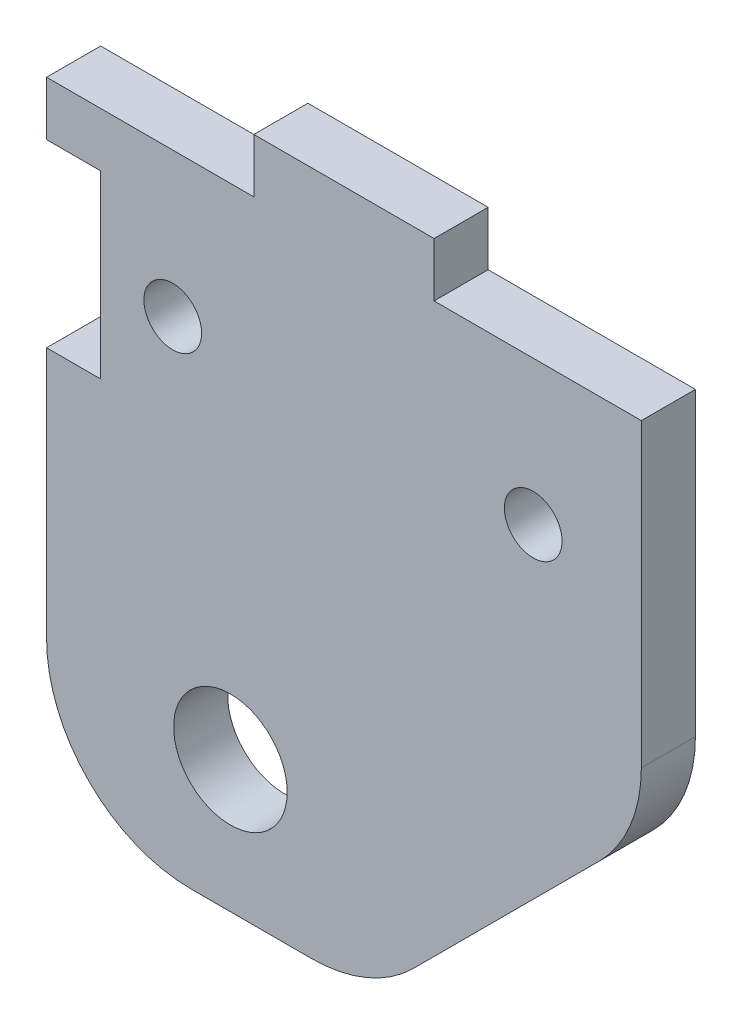
ISO-10303-21;
HEADER;
FILE_DESCRIPTION(('STEP AP214'),'2;1');
FILE_NAME('part.step','',(''),(''),'','','');
FILE_SCHEMA(('AUTOMOTIVE_DESIGN { 1 0 10303 214 1 1 1 1 }'));
ENDSEC;
DATA;
#1=APPLICATION_CONTEXT('core data for automotive mechanical design processes');
#2=APPLICATION_PROTOCOL_DEFINITION('international standard','automotive_design',2000,#1);
#3=PRODUCT_CONTEXT('',#1,'mechanical');
#4=PRODUCT('Part','Part','',(#3));
#5=PRODUCT_RELATED_PRODUCT_CATEGORY('part','',(#4));
#6=PRODUCT_DEFINITION_FORMATION('','',#4);
#7=PRODUCT_DEFINITION_CONTEXT('part definition',#1,'design');
#8=PRODUCT_DEFINITION('design','',#6,#7);
#9=PRODUCT_DEFINITION_SHAPE('','',#8);
#10=(LENGTH_UNIT() NAMED_UNIT(*) SI_UNIT(.MILLI.,.METRE.));
#11=(NAMED_UNIT(*) PLANE_ANGLE_UNIT() SI_UNIT($,.RADIAN.));
#12=(NAMED_UNIT(*) SI_UNIT($,.STERADIAN.) SOLID_ANGLE_UNIT());
#13=UNCERTAINTY_MEASURE_WITH_UNIT(LENGTH_MEASURE(1.E-05),#10,'distance_accuracy_value','');
#14=(GEOMETRIC_REPRESENTATION_CONTEXT(3) GLOBAL_UNCERTAINTY_ASSIGNED_CONTEXT((#13)) GLOBAL_UNIT_ASSIGNED_CONTEXT((#10,
#11,#12)) REPRESENTATION_CONTEXT('',''));
#15=CARTESIAN_POINT('',(0.,0.,0.));
#16=DIRECTION('',(0.,0.,1.));
#17=DIRECTION('',(1.,0.,0.));
#18=AXIS2_PLACEMENT_3D('',#15,#16,#17);
#19=CARTESIAN_POINT('',(0.,-3.,3.));
#20=DIRECTION('',(0.,-1.,0.));
#21=DIRECTION('',(1.,0.,0.));
#22=AXIS2_PLACEMENT_3D('',#19,#20,#21);
#23=PLANE('',#22);
#24=DIRECTION('',(-1.,0.,0.));
#25=VECTOR('',#24,1.);
#26=CARTESIAN_POINT('',(0.,-3.,0.));
#27=LINE('',#26,#25);
#28=CARTESIAN_POINT('',(3.,-3.,0.));
#29=VERTEX_POINT('',#28);
#30=CARTESIAN_POINT('',(0.,-3.,0.));
#31=VERTEX_POINT('',#30);
#32=EDGE_CURVE('E162',#29,#31,#27,.T.);
#33=ORIENTED_EDGE('',*,*,#32,.F.);
#34=DIRECTION('',(0.,0.,-1.));
#35=VECTOR('',#34,1.);
#36=CARTESIAN_POINT('',(3.,-3.,3.));
#37=LINE('',#36,#35);
#38=CARTESIAN_POINT('',(3.,-3.,3.));
#39=VERTEX_POINT('',#38);
#40=EDGE_CURVE('E157',#39,#29,#37,.T.);
#41=ORIENTED_EDGE('',*,*,#40,.F.);
#42=DIRECTION('',(-1.,0.,0.));
#43=VECTOR('',#42,1.);
#44=CARTESIAN_POINT('',(0.,-3.,3.));
#45=LINE('',#44,#43);
#46=CARTESIAN_POINT('',(0.,-3.,3.));
#47=VERTEX_POINT('',#46);
#48=EDGE_CURVE('E159',#39,#47,#45,.T.);
#49=ORIENTED_EDGE('',*,*,#48,.T.);
#50=DIRECTION('',(0.,0.,-1.));
#51=VECTOR('',#50,1.);
#52=CARTESIAN_POINT('',(0.,-3.,3.));
#53=LINE('',#52,#51);
#54=EDGE_CURVE('E243',#47,#31,#53,.T.);
#55=ORIENTED_EDGE('',*,*,#54,.T.);
#56=EDGE_LOOP('',(#33,#41,#49,#55));
#57=FACE_BOUND('',#56,.T.);
#58=ADVANCED_FACE('F41',(#57),#23,.T.);
#59=CARTESIAN_POINT('',(3.,0.,3.));
#60=DIRECTION('',(-1.,0.,0.));
#61=DIRECTION('',(0.,0.,1.));
#62=AXIS2_PLACEMENT_3D('',#59,#60,#61);
#63=PLANE('',#62);
#64=DIRECTION('',(0.,1.,0.));
#65=VECTOR('',#64,1.);
#66=CARTESIAN_POINT('',(3.,0.,0.));
#67=LINE('',#66,#65);
#68=CARTESIAN_POINT('',(3.,-13.,0.));
#69=VERTEX_POINT('',#68);
#70=EDGE_CURVE('E216',#69,#29,#67,.T.);
#71=ORIENTED_EDGE('',*,*,#70,.F.);
#72=DIRECTION('',(0.,0.,-1.));
#73=VECTOR('',#72,1.);
#74=CARTESIAN_POINT('',(3.,-13.,3.));
#75=LINE('',#74,#73);
#76=CARTESIAN_POINT('',(3.,-13.,3.));
#77=VERTEX_POINT('',#76);
#78=EDGE_CURVE('E168',#77,#69,#75,.T.);
#79=ORIENTED_EDGE('',*,*,#78,.F.);
#80=DIRECTION('',(0.,1.,0.));
#81=VECTOR('',#80,1.);
#82=CARTESIAN_POINT('',(3.,0.,3.));
#83=LINE('',#82,#81);
#84=EDGE_CURVE('E174',#77,#39,#83,.T.);
#85=ORIENTED_EDGE('',*,*,#84,.T.);
#86=ORIENTED_EDGE('',*,*,#40,.T.);
#87=EDGE_LOOP('',(#71,#79,#85,#86));
#88=FACE_BOUND('',#87,.T.);
#89=ADVANCED_FACE('F180',(#88),#63,.T.);
#90=CARTESIAN_POINT('',(0.,-13.,3.));
#91=DIRECTION('',(0.,-1.,0.));
#92=DIRECTION('',(0.,0.,-1.));
#93=AXIS2_PLACEMENT_3D('',#90,#91,#92);
#94=PLANE('',#93);
#95=DIRECTION('',(-1.,0.,0.));
#96=VECTOR('',#95,1.);
#97=CARTESIAN_POINT('',(0.,-13.,0.));
#98=LINE('',#97,#96);
#99=CARTESIAN_POINT('',(0.,-13.,0.));
#100=VERTEX_POINT('',#99);
#101=EDGE_CURVE('E218',#69,#100,#98,.T.);
#102=ORIENTED_EDGE('',*,*,#101,.T.);
#103=DIRECTION('',(0.,0.,-1.));
#104=VECTOR('',#103,1.);
#105=CARTESIAN_POINT('',(0.,-13.,3.));
#106=LINE('',#105,#104);
#107=CARTESIAN_POINT('',(0.,-13.,3.));
#108=VERTEX_POINT('',#107);
#109=EDGE_CURVE('E258',#108,#100,#106,.T.);
#110=ORIENTED_EDGE('',*,*,#109,.F.);
#111=DIRECTION('',(-1.,0.,0.));
#112=VECTOR('',#111,1.);
#113=CARTESIAN_POINT('',(0.,-13.,3.));
#114=LINE('',#113,#112);
#115=EDGE_CURVE('E182',#77,#108,#114,.T.);
#116=ORIENTED_EDGE('',*,*,#115,.F.);
#117=ORIENTED_EDGE('',*,*,#78,.T.);
#118=EDGE_LOOP('',(#102,#110,#116,#117));
#119=FACE_BOUND('',#118,.T.);
#120=ADVANCED_FACE('F308',(#119),#94,.F.);
#121=CARTESIAN_POINT('',(0.,0.,3.));
#122=DIRECTION('',(-1.,0.,0.));
#123=DIRECTION('',(0.,0.,1.));
#124=AXIS2_PLACEMENT_3D('',#121,#122,#123);
#125=PLANE('',#124);
#126=DIRECTION('',(0.,1.,0.));
#127=VECTOR('',#126,1.);
#128=CARTESIAN_POINT('',(0.,0.,0.));
#129=LINE('',#128,#127);
#130=CARTESIAN_POINT('',(0.,-27.,0.));
#131=VERTEX_POINT('',#130);
#132=EDGE_CURVE('E221',#131,#100,#129,.T.);
#133=ORIENTED_EDGE('',*,*,#132,.F.);
#134=DIRECTION('',(0.,0.,-1.));
#135=VECTOR('',#134,1.);
#136=CARTESIAN_POINT('',(0.,-27.,3.));
#137=LINE('',#136,#135);
#138=CARTESIAN_POINT('',(0.,-27.,3.));
#139=VERTEX_POINT('',#138);
#140=EDGE_CURVE('E278',#131,#139,#137,.F.);
#141=ORIENTED_EDGE('',*,*,#140,.T.);
#142=DIRECTION('',(0.,1.,0.));
#143=VECTOR('',#142,1.);
#144=CARTESIAN_POINT('',(0.,0.,3.));
#145=LINE('',#144,#143);
#146=EDGE_CURVE('E184',#139,#108,#145,.T.);
#147=ORIENTED_EDGE('',*,*,#146,.T.);
#148=ORIENTED_EDGE('',*,*,#109,.T.);
#149=EDGE_LOOP('',(#133,#141,#147,#148));
#150=FACE_BOUND('',#149,.T.);
#151=ADVANCED_FACE('F305',(#150),#125,.T.);
#152=CARTESIAN_POINT('',(0.,-35.,3.));
#153=DIRECTION('',(0.,-1.,0.));
#154=DIRECTION('',(1.,0.,0.));
#155=AXIS2_PLACEMENT_3D('',#152,#153,#154);
#156=PLANE('',#155);
#157=DIRECTION('',(-1.,0.,0.));
#158=VECTOR('',#157,1.);
#159=CARTESIAN_POINT('',(0.,-35.,3.));
#160=LINE('',#159,#158);
#161=CARTESIAN_POINT('',(14.6862915010152,-35.,3.));
#162=VERTEX_POINT('',#161);
#163=CARTESIAN_POINT('',(8.,-35.,3.));
#164=VERTEX_POINT('',#163);
#165=EDGE_CURVE('E189',#162,#164,#160,.T.);
#166=ORIENTED_EDGE('',*,*,#165,.T.);
#167=DIRECTION('',(0.,0.,-1.));
#168=VECTOR('',#167,1.);
#169=CARTESIAN_POINT('',(8.,-35.,3.));
#170=LINE('',#169,#168);
#171=CARTESIAN_POINT('',(8.,-35.,0.));
#172=VERTEX_POINT('',#171);
#173=EDGE_CURVE('E269',#164,#172,#170,.T.);
#174=ORIENTED_EDGE('',*,*,#173,.T.);
#175=DIRECTION('',(-1.,0.,0.));
#176=VECTOR('',#175,1.);
#177=CARTESIAN_POINT('',(0.,-35.,0.));
#178=LINE('',#177,#176);
#179=CARTESIAN_POINT('',(14.6862915010152,-35.,0.));
#180=VERTEX_POINT('',#179);
#181=EDGE_CURVE('E223',#180,#172,#178,.T.);
#182=ORIENTED_EDGE('',*,*,#181,.F.);
#183=DIRECTION('',(0.,0.,-1.));
#184=VECTOR('',#183,1.);
#185=CARTESIAN_POINT('',(14.6862915010152,-35.,3.));
#186=LINE('',#185,#184);
#187=EDGE_CURVE('E266',#180,#162,#186,.F.);
#188=ORIENTED_EDGE('',*,*,#187,.T.);
#189=EDGE_LOOP('',(#166,#174,#182,#188));
#190=FACE_BOUND('',#189,.T.);
#191=ADVANCED_FACE('F296',(#190),#156,.T.);
#192=CARTESIAN_POINT('',(33.,0.,3.));
#193=DIRECTION('',(1.,0.,0.));
#194=DIRECTION('',(0.,1.,0.));
#195=AXIS2_PLACEMENT_3D('',#192,#193,#194);
#196=PLANE('',#195);
#197=DIRECTION('',(0.,-1.,0.));
#198=VECTOR('',#197,1.);
#199=CARTESIAN_POINT('',(33.,0.,3.));
#200=LINE('',#199,#198);
#201=CARTESIAN_POINT('',(33.,0.,3.));
#202=VERTEX_POINT('',#201);
#203=CARTESIAN_POINT('',(33.,-16.6862915010152,3.));
#204=VERTEX_POINT('',#203);
#205=EDGE_CURVE('E192',#202,#204,#200,.T.);
#206=ORIENTED_EDGE('',*,*,#205,.T.);
#207=DIRECTION('',(0.,0.,1.));
#208=VECTOR('',#207,1.);
#209=CARTESIAN_POINT('',(33.,-16.6862915010152,3.));
#210=LINE('',#209,#208);
#211=CARTESIAN_POINT('',(33.,-16.6862915010152,0.));
#212=VERTEX_POINT('',#211);
#213=EDGE_CURVE('E11',#204,#212,#210,.F.);
#214=ORIENTED_EDGE('',*,*,#213,.T.);
#215=DIRECTION('',(0.,-1.,0.));
#216=VECTOR('',#215,1.);
#217=CARTESIAN_POINT('',(33.,0.,0.));
#218=LINE('',#217,#216);
#219=CARTESIAN_POINT('',(33.,0.,0.));
#220=VERTEX_POINT('',#219);
#221=EDGE_CURVE('E227',#220,#212,#218,.T.);
#222=ORIENTED_EDGE('',*,*,#221,.F.);
#223=DIRECTION('',(0.,0.,-1.));
#224=VECTOR('',#223,1.);
#225=CARTESIAN_POINT('',(33.,0.,3.));
#226=LINE('',#225,#224);
#227=EDGE_CURVE('E256',#202,#220,#226,.T.);
#228=ORIENTED_EDGE('',*,*,#227,.F.);
#229=EDGE_LOOP('',(#206,#214,#222,#228));
#230=FACE_BOUND('',#229,.T.);
#231=ADVANCED_FACE('F340',(#230),#196,.T.);
#232=CARTESIAN_POINT('',(0.,0.,3.));
#233=DIRECTION('',(0.,1.,0.));
#234=DIRECTION('',(0.,0.,1.));
#235=AXIS2_PLACEMENT_3D('',#232,#233,#234);
#236=PLANE('',#235);
#237=DIRECTION('',(1.,0.,0.));
#238=VECTOR('',#237,1.);
#239=CARTESIAN_POINT('',(0.,0.,0.));
#240=LINE('',#239,#238);
#241=CARTESIAN_POINT('',(21.5,0.,0.));
#242=VERTEX_POINT('',#241);
#243=EDGE_CURVE('E230',#242,#220,#240,.T.);
#244=ORIENTED_EDGE('',*,*,#243,.F.);
#245=DIRECTION('',(0.,0.,-1.));
#246=VECTOR('',#245,1.);
#247=CARTESIAN_POINT('',(21.5,0.,3.));
#248=LINE('',#247,#246);
#249=CARTESIAN_POINT('',(21.5,0.,3.));
#250=VERTEX_POINT('',#249);
#251=EDGE_CURVE('E254',#250,#242,#248,.T.);
#252=ORIENTED_EDGE('',*,*,#251,.F.);
#253=DIRECTION('',(1.,0.,0.));
#254=VECTOR('',#253,1.);
#255=CARTESIAN_POINT('',(0.,0.,3.));
#256=LINE('',#255,#254);
#257=EDGE_CURVE('E194',#250,#202,#256,.T.);
#258=ORIENTED_EDGE('',*,*,#257,.T.);
#259=ORIENTED_EDGE('',*,*,#227,.T.);
#260=EDGE_LOOP('',(#244,#252,#258,#259));
#261=FACE_BOUND('',#260,.T.);
#262=ADVANCED_FACE('F337',(#261),#236,.T.);
#263=CARTESIAN_POINT('',(21.5,0.,3.));
#264=DIRECTION('',(1.,0.,0.));
#265=DIRECTION('',(0.,0.,-1.));
#266=AXIS2_PLACEMENT_3D('',#263,#264,#265);
#267=PLANE('',#266);
#268=DIRECTION('',(0.,-1.,0.));
#269=VECTOR('',#268,1.);
#270=CARTESIAN_POINT('',(21.5,0.,0.));
#271=LINE('',#270,#269);
#272=CARTESIAN_POINT('',(21.5,3.,0.));
#273=VERTEX_POINT('',#272);
#274=EDGE_CURVE('E233',#273,#242,#271,.T.);
#275=ORIENTED_EDGE('',*,*,#274,.F.);
#276=DIRECTION('',(0.,0.,-1.));
#277=VECTOR('',#276,1.);
#278=CARTESIAN_POINT('',(21.5,3.,3.));
#279=LINE('',#278,#277);
#280=CARTESIAN_POINT('',(21.5,3.,3.));
#281=VERTEX_POINT('',#280);
#282=EDGE_CURVE('E252',#281,#273,#279,.T.);
#283=ORIENTED_EDGE('',*,*,#282,.F.);
#284=DIRECTION('',(0.,-1.,0.));
#285=VECTOR('',#284,1.);
#286=CARTESIAN_POINT('',(21.5,0.,3.));
#287=LINE('',#286,#285);
#288=EDGE_CURVE('E197',#281,#250,#287,.T.);
#289=ORIENTED_EDGE('',*,*,#288,.T.);
#290=ORIENTED_EDGE('',*,*,#251,.T.);
#291=EDGE_LOOP('',(#275,#283,#289,#290));
#292=FACE_BOUND('',#291,.T.);
#293=ADVANCED_FACE('F332',(#292),#267,.T.);
#294=CARTESIAN_POINT('',(0.,2.99999999999999,3.));
#295=DIRECTION('',(0.,-1.,0.));
#296=DIRECTION('',(1.,0.,0.));
#297=AXIS2_PLACEMENT_3D('',#294,#295,#296);
#298=PLANE('',#297);
#299=DIRECTION('',(-1.,0.,0.));
#300=VECTOR('',#299,1.);
#301=CARTESIAN_POINT('',(0.,2.99999999999999,0.));
#302=LINE('',#301,#300);
#303=CARTESIAN_POINT('',(11.5,3.,0.));
#304=VERTEX_POINT('',#303);
#305=EDGE_CURVE('E237',#273,#304,#302,.T.);
#306=ORIENTED_EDGE('',*,*,#305,.T.);
#307=DIRECTION('',(0.,0.,-1.));
#308=VECTOR('',#307,1.);
#309=CARTESIAN_POINT('',(11.5,3.,3.));
#310=LINE('',#309,#308);
#311=CARTESIAN_POINT('',(11.5,3.,3.));
#312=VERTEX_POINT('',#311);
#313=EDGE_CURVE('E249',#312,#304,#310,.T.);
#314=ORIENTED_EDGE('',*,*,#313,.F.);
#315=DIRECTION('',(-1.,0.,0.));
#316=VECTOR('',#315,1.);
#317=CARTESIAN_POINT('',(0.,2.99999999999999,3.));
#318=LINE('',#317,#316);
#319=EDGE_CURVE('E201',#281,#312,#318,.T.);
#320=ORIENTED_EDGE('',*,*,#319,.F.);
#321=ORIENTED_EDGE('',*,*,#282,.T.);
#322=EDGE_LOOP('',(#306,#314,#320,#321));
#323=FACE_BOUND('',#322,.T.);
#324=ADVANCED_FACE('F329',(#323),#298,.F.);
#325=CARTESIAN_POINT('',(11.5,0.,3.));
#326=DIRECTION('',(1.,0.,0.));
#327=DIRECTION('',(0.,1.,0.));
#328=AXIS2_PLACEMENT_3D('',#325,#326,#327);
#329=PLANE('',#328);
#330=DIRECTION('',(0.,-1.,0.));
#331=VECTOR('',#330,1.);
#332=CARTESIAN_POINT('',(11.5,0.,0.));
#333=LINE('',#332,#331);
#334=CARTESIAN_POINT('',(11.5,0.,0.));
#335=VERTEX_POINT('',#334);
#336=EDGE_CURVE('E240',#304,#335,#333,.T.);
#337=ORIENTED_EDGE('',*,*,#336,.T.);
#338=DIRECTION('',(0.,0.,-1.));
#339=VECTOR('',#338,1.);
#340=CARTESIAN_POINT('',(11.5,0.,3.));
#341=LINE('',#340,#339);
#342=CARTESIAN_POINT('',(11.5,0.,3.));
#343=VERTEX_POINT('',#342);
#344=EDGE_CURVE('E247',#343,#335,#341,.T.);
#345=ORIENTED_EDGE('',*,*,#344,.F.);
#346=DIRECTION('',(0.,-1.,0.));
#347=VECTOR('',#346,1.);
#348=CARTESIAN_POINT('',(11.5,0.,3.));
#349=LINE('',#348,#347);
#350=EDGE_CURVE('E204',#312,#343,#349,.T.);
#351=ORIENTED_EDGE('',*,*,#350,.F.);
#352=ORIENTED_EDGE('',*,*,#313,.T.);
#353=EDGE_LOOP('',(#337,#345,#351,#352));
#354=FACE_BOUND('',#353,.T.);
#355=ADVANCED_FACE('F325',(#354),#329,.F.);
#356=CARTESIAN_POINT('',(0.,0.,0.));
#357=VERTEX_POINT('',#356);
#358=EDGE_CURVE('E234',#357,#335,#240,.T.);
#359=ORIENTED_EDGE('',*,*,#358,.F.);
#360=DIRECTION('',(0.,0.,-1.));
#361=VECTOR('',#360,1.);
#362=CARTESIAN_POINT('',(0.,0.,3.));
#363=LINE('',#362,#361);
#364=CARTESIAN_POINT('',(0.,0.,3.));
#365=VERTEX_POINT('',#364);
#366=EDGE_CURVE('E245',#365,#357,#363,.T.);
#367=ORIENTED_EDGE('',*,*,#366,.F.);
#368=EDGE_CURVE('E198',#365,#343,#256,.T.);
#369=ORIENTED_EDGE('',*,*,#368,.T.);
#370=ORIENTED_EDGE('',*,*,#344,.T.);
#371=EDGE_LOOP('',(#359,#367,#369,#370));
#372=FACE_BOUND('',#371,.T.);
#373=ADVANCED_FACE('F321',(#372),#236,.T.);
#374=CARTESIAN_POINT('',(10.2,-27.6842951390846,3.));
#375=DIRECTION('',(0.,0.,-1.));
#376=DIRECTION('',(-1.,0.,0.));
#377=AXIS2_PLACEMENT_3D('',#374,#375,#376);
#378=CYLINDRICAL_SURFACE('',#377,3.14999999999995);
#379=CARTESIAN_POINT('',(10.2,-27.6842951390846,3.));
#380=DIRECTION('',(0.,0.,1.));
#381=DIRECTION('',(1.,0.,0.));
#382=AXIS2_PLACEMENT_3D('',#379,#380,#381);
#383=CIRCLE('',#382,3.14999999999995);
#384=CARTESIAN_POINT('',(13.3499999999999,-27.6842951390846,3.));
#385=VERTEX_POINT('',#384);
#386=EDGE_CURVE('E178',#385,#385,#383,.T.);
#387=ORIENTED_EDGE('',*,*,#386,.T.);
#388=EDGE_LOOP('',(#387));
#389=FACE_BOUND('',#388,.T.);
#390=CARTESIAN_POINT('',(10.2,-27.6842951390846,0.));
#391=DIRECTION('',(0.,0.,1.));
#392=DIRECTION('',(1.,0.,0.));
#393=AXIS2_PLACEMENT_3D('',#390,#391,#392);
#394=CIRCLE('',#393,3.14999999999995);
#395=CARTESIAN_POINT('',(13.3499999999999,-27.6842951390846,0.));
#396=VERTEX_POINT('',#395);
#397=EDGE_CURVE('E212',#396,#396,#394,.T.);
#398=ORIENTED_EDGE('',*,*,#397,.F.);
#399=EDGE_LOOP('',(#398));
#400=FACE_BOUND('',#399,.T.);
#401=ADVANCED_FACE('F355',(#389,#400),#378,.F.);
#402=CARTESIAN_POINT('',(27.,-8.,3.));
#403=DIRECTION('',(0.,0.,-1.));
#404=DIRECTION('',(-1.,0.,0.));
#405=AXIS2_PLACEMENT_3D('',#402,#403,#404);
#406=CYLINDRICAL_SURFACE('',#405,1.5999999999999);
#407=CARTESIAN_POINT('',(27.,-8.,3.));
#408=DIRECTION('',(0.,0.,1.));
#409=DIRECTION('',(1.,0.,0.));
#410=AXIS2_PLACEMENT_3D('',#407,#408,#409);
#411=CIRCLE('',#410,1.5999999999999);
#412=CARTESIAN_POINT('',(28.5999999999999,-8.,3.));
#413=VERTEX_POINT('',#412);
#414=EDGE_CURVE('E317',#413,#413,#411,.T.);
#415=ORIENTED_EDGE('',*,*,#414,.T.);
#416=EDGE_LOOP('',(#415));
#417=FACE_BOUND('',#416,.T.);
#418=CARTESIAN_POINT('',(27.,-8.,0.));
#419=DIRECTION('',(0.,0.,1.));
#420=DIRECTION('',(1.,0.,0.));
#421=AXIS2_PLACEMENT_3D('',#418,#419,#420);
#422=CIRCLE('',#421,1.5999999999999);
#423=CARTESIAN_POINT('',(28.5999999999999,-8.,0.));
#424=VERTEX_POINT('',#423);
#425=EDGE_CURVE('E209',#424,#424,#422,.T.);
#426=ORIENTED_EDGE('',*,*,#425,.F.);
#427=EDGE_LOOP('',(#426));
#428=FACE_BOUND('',#427,.T.);
#429=ADVANCED_FACE('F358',(#417,#428),#406,.F.);
#430=CARTESIAN_POINT('',(7.,-8.,3.));
#431=DIRECTION('',(0.,0.,-1.));
#432=DIRECTION('',(-1.,0.,0.));
#433=AXIS2_PLACEMENT_3D('',#430,#431,#432);
#434=CYLINDRICAL_SURFACE('',#433,1.6);
#435=CARTESIAN_POINT('',(7.,-8.,3.));
#436=DIRECTION('',(0.,0.,1.));
#437=DIRECTION('',(1.,0.,0.));
#438=AXIS2_PLACEMENT_3D('',#435,#436,#437);
#439=CIRCLE('',#438,1.6);
#440=CARTESIAN_POINT('',(8.6,-8.,3.));
#441=VERTEX_POINT('',#440);
#442=EDGE_CURVE('E315',#441,#441,#439,.T.);
#443=ORIENTED_EDGE('',*,*,#442,.T.);
#444=EDGE_LOOP('',(#443));
#445=FACE_BOUND('',#444,.T.);
#446=CARTESIAN_POINT('',(7.,-8.,0.));
#447=DIRECTION('',(0.,0.,1.));
#448=DIRECTION('',(1.,0.,0.));
#449=AXIS2_PLACEMENT_3D('',#446,#447,#448);
#450=CIRCLE('',#449,1.6);
#451=CARTESIAN_POINT('',(8.6,-8.,0.));
#452=VERTEX_POINT('',#451);
#453=EDGE_CURVE('E206',#452,#452,#450,.T.);
#454=ORIENTED_EDGE('',*,*,#453,.F.);
#455=EDGE_LOOP('',(#454));
#456=FACE_BOUND('',#455,.T.);
#457=ADVANCED_FACE('F362',(#445,#456),#434,.F.);
#458=EDGE_CURVE('E224',#31,#357,#129,.T.);
#459=ORIENTED_EDGE('',*,*,#458,.F.);
#460=ORIENTED_EDGE('',*,*,#54,.F.);
#461=EDGE_CURVE('E177',#47,#365,#145,.T.);
#462=ORIENTED_EDGE('',*,*,#461,.T.);
#463=ORIENTED_EDGE('',*,*,#366,.T.);
#464=EDGE_LOOP('',(#459,#460,#462,#463));
#465=FACE_BOUND('',#464,.T.);
#466=ADVANCED_FACE('F313',(#465),#125,.T.);
#467=CARTESIAN_POINT('',(0.,0.,3.));
#468=DIRECTION('',(0.,0.,1.));
#469=DIRECTION('',(1.,0.,0.));
#470=AXIS2_PLACEMENT_3D('',#467,#468,#469);
#471=PLANE('',#470);
#472=ORIENTED_EDGE('',*,*,#442,.F.);
#473=EDGE_LOOP('',(#472));
#474=FACE_BOUND('',#473,.T.);
#475=ORIENTED_EDGE('',*,*,#414,.F.);
#476=EDGE_LOOP('',(#475));
#477=FACE_BOUND('',#476,.T.);
#478=ORIENTED_EDGE('',*,*,#386,.F.);
#479=EDGE_LOOP('',(#478));
#480=FACE_BOUND('',#479,.T.);
#481=ORIENTED_EDGE('',*,*,#146,.F.);
#482=CARTESIAN_POINT('',(8.,-27.,3.));
#483=DIRECTION('',(0.,0.,1.));
#484=DIRECTION('',(1.,0.,0.));
#485=AXIS2_PLACEMENT_3D('',#482,#483,#484);
#486=CIRCLE('',#485,8.);
#487=EDGE_CURVE('E283',#139,#164,#486,.T.);
#488=ORIENTED_EDGE('',*,*,#487,.T.);
#489=ORIENTED_EDGE('',*,*,#165,.F.);
#490=CARTESIAN_POINT('',(14.6862915010152,-27.,3.));
#491=DIRECTION('',(0.,0.,1.));
#492=DIRECTION('',(1.,0.,0.));
#493=AXIS2_PLACEMENT_3D('',#490,#491,#492);
#494=CIRCLE('',#493,8.);
#495=CARTESIAN_POINT('',(20.3431457505076,-32.6568542494924,3.));
#496=VERTEX_POINT('',#495);
#497=EDGE_CURVE('E281',#162,#496,#494,.T.);
#498=ORIENTED_EDGE('',*,*,#497,.T.);
#499=DIRECTION('',(-0.707106781186549,-0.707106781186546,0.));
#500=VECTOR('',#499,1.);
#501=CARTESIAN_POINT('',(26.4999999999999,-26.5,3.));
#502=LINE('',#501,#500);
#503=CARTESIAN_POINT('',(30.6568542494924,-22.3431457505076,3.));
#504=VERTEX_POINT('',#503);
#505=EDGE_CURVE('E264',#496,#504,#502,.F.);
#506=ORIENTED_EDGE('',*,*,#505,.T.);
#507=CARTESIAN_POINT('',(25.,-16.6862915010152,3.));
#508=DIRECTION('',(0.,0.,1.));
#509=DIRECTION('',(1.,0.,0.));
#510=AXIS2_PLACEMENT_3D('',#507,#508,#509);
#511=CIRCLE('',#510,8.);
#512=EDGE_CURVE('E56',#504,#204,#511,.T.);
#513=ORIENTED_EDGE('',*,*,#512,.T.);
#514=ORIENTED_EDGE('',*,*,#205,.F.);
#515=ORIENTED_EDGE('',*,*,#257,.F.);
#516=ORIENTED_EDGE('',*,*,#288,.F.);
#517=ORIENTED_EDGE('',*,*,#319,.T.);
#518=ORIENTED_EDGE('',*,*,#350,.T.);
#519=ORIENTED_EDGE('',*,*,#368,.F.);
#520=ORIENTED_EDGE('',*,*,#461,.F.);
#521=ORIENTED_EDGE('',*,*,#48,.F.);
#522=ORIENTED_EDGE('',*,*,#84,.F.);
#523=ORIENTED_EDGE('',*,*,#115,.T.);
#524=EDGE_LOOP('',(#481,#488,#489,#498,#506,#513,#514,#515,#516,#517,#518,#519,#520,#521,#522,#523));
#525=FACE_BOUND('',#524,.T.);
#526=ADVANCED_FACE('F172',(#474,#477,#480,#525),#471,.T.);
#527=CARTESIAN_POINT('',(0.,0.,0.));
#528=DIRECTION('',(0.,0.,1.));
#529=DIRECTION('',(1.,0.,0.));
#530=AXIS2_PLACEMENT_3D('',#527,#528,#529);
#531=PLANE('',#530);
#532=ORIENTED_EDGE('',*,*,#453,.T.);
#533=EDGE_LOOP('',(#532));
#534=FACE_BOUND('',#533,.T.);
#535=ORIENTED_EDGE('',*,*,#425,.T.);
#536=EDGE_LOOP('',(#535));
#537=FACE_BOUND('',#536,.T.);
#538=ORIENTED_EDGE('',*,*,#397,.T.);
#539=EDGE_LOOP('',(#538));
#540=FACE_BOUND('',#539,.T.);
#541=ORIENTED_EDGE('',*,*,#181,.T.);
#542=CARTESIAN_POINT('',(8.,-27.,0.));
#543=DIRECTION('',(0.,0.,1.));
#544=DIRECTION('',(1.,0.,0.));
#545=AXIS2_PLACEMENT_3D('',#542,#543,#544);
#546=CIRCLE('',#545,8.);
#547=EDGE_CURVE('E276',#172,#131,#546,.F.);
#548=ORIENTED_EDGE('',*,*,#547,.T.);
#549=ORIENTED_EDGE('',*,*,#132,.T.);
#550=ORIENTED_EDGE('',*,*,#101,.F.);
#551=ORIENTED_EDGE('',*,*,#70,.T.);
#552=ORIENTED_EDGE('',*,*,#32,.T.);
#553=ORIENTED_EDGE('',*,*,#458,.T.);
#554=ORIENTED_EDGE('',*,*,#358,.T.);
#555=ORIENTED_EDGE('',*,*,#336,.F.);
#556=ORIENTED_EDGE('',*,*,#305,.F.);
#557=ORIENTED_EDGE('',*,*,#274,.T.);
#558=ORIENTED_EDGE('',*,*,#243,.T.);
#559=ORIENTED_EDGE('',*,*,#221,.T.);
#560=CARTESIAN_POINT('',(25.,-16.6862915010152,0.));
#561=DIRECTION('',(0.,0.,1.));
#562=DIRECTION('',(1.,0.,0.));
#563=AXIS2_PLACEMENT_3D('',#560,#561,#562);
#564=CIRCLE('',#563,8.);
#565=CARTESIAN_POINT('',(30.6568542494924,-22.3431457505076,0.));
#566=VERTEX_POINT('',#565);
#567=EDGE_CURVE('E272',#212,#566,#564,.F.);
#568=ORIENTED_EDGE('',*,*,#567,.T.);
#569=DIRECTION('',(0.707106781186549,0.707106781186546,0.));
#570=VECTOR('',#569,1.);
#571=CARTESIAN_POINT('',(33.,-20.,0.));
#572=LINE('',#571,#570);
#573=CARTESIAN_POINT('',(20.3431457505076,-32.6568542494924,0.));
#574=VERTEX_POINT('',#573);
#575=EDGE_CURVE('E167',#566,#574,#572,.F.);
#576=ORIENTED_EDGE('',*,*,#575,.T.);
#577=CARTESIAN_POINT('',(14.6862915010152,-27.,0.));
#578=DIRECTION('',(0.,0.,1.));
#579=DIRECTION('',(1.,0.,0.));
#580=AXIS2_PLACEMENT_3D('',#577,#578,#579);
#581=CIRCLE('',#580,8.);
#582=EDGE_CURVE('E274',#574,#180,#581,.F.);
#583=ORIENTED_EDGE('',*,*,#582,.T.);
#584=EDGE_LOOP('',(#541,#548,#549,#550,#551,#552,#553,#554,#555,#556,#557,#558,#559,#568,#576,#583));
#585=FACE_BOUND('',#584,.T.);
#586=ADVANCED_FACE('F290',(#534,#537,#540,#585),#531,.F.);
#587=CARTESIAN_POINT('',(33.,-20.,3.));
#588=DIRECTION('',(-0.707106781186546,0.707106781186549,0.));
#589=DIRECTION('',(0.,0.,-1.));
#590=AXIS2_PLACEMENT_3D('',#587,#588,#589);
#591=PLANE('',#590);
#592=ORIENTED_EDGE('',*,*,#505,.F.);
#593=DIRECTION('',(0.,0.,1.));
#594=VECTOR('',#593,1.);
#595=CARTESIAN_POINT('',(20.3431457505076,-32.6568542494924,3.));
#596=LINE('',#595,#594);
#597=EDGE_CURVE('E49',#496,#574,#596,.F.);
#598=ORIENTED_EDGE('',*,*,#597,.T.);
#599=ORIENTED_EDGE('',*,*,#575,.F.);
#600=DIRECTION('',(0.,0.,-1.));
#601=VECTOR('',#600,1.);
#602=CARTESIAN_POINT('',(30.6568542494924,-22.3431457505076,3.));
#603=LINE('',#602,#601);
#604=EDGE_CURVE('E64',#566,#504,#603,.F.);
#605=ORIENTED_EDGE('',*,*,#604,.T.);
#606=EDGE_LOOP('',(#592,#598,#599,#605));
#607=FACE_BOUND('',#606,.T.);
#608=ADVANCED_FACE('F286',(#607),#591,.F.);
#609=CARTESIAN_POINT('',(8.,-27.,3.));
#610=DIRECTION('',(0.,0.,-1.));
#611=DIRECTION('',(-1.,0.,0.));
#612=AXIS2_PLACEMENT_3D('',#609,#610,#611);
#613=CYLINDRICAL_SURFACE('',#612,8.);
#614=ORIENTED_EDGE('',*,*,#487,.F.);
#615=ORIENTED_EDGE('',*,*,#140,.F.);
#616=ORIENTED_EDGE('',*,*,#547,.F.);
#617=ORIENTED_EDGE('',*,*,#173,.F.);
#618=EDGE_LOOP('',(#614,#615,#616,#617));
#619=FACE_BOUND('',#618,.T.);
#620=ADVANCED_FACE('F301',(#619),#613,.T.);
#621=CARTESIAN_POINT('',(14.6862915010152,-27.,3.));
#622=DIRECTION('',(0.,0.,-1.));
#623=DIRECTION('',(-1.,0.,0.));
#624=AXIS2_PLACEMENT_3D('',#621,#622,#623);
#625=CYLINDRICAL_SURFACE('',#624,8.);
#626=ORIENTED_EDGE('',*,*,#582,.F.);
#627=ORIENTED_EDGE('',*,*,#597,.F.);
#628=ORIENTED_EDGE('',*,*,#497,.F.);
#629=ORIENTED_EDGE('',*,*,#187,.F.);
#630=EDGE_LOOP('',(#626,#627,#628,#629));
#631=FACE_BOUND('',#630,.T.);
#632=ADVANCED_FACE('F293',(#631),#625,.T.);
#633=CARTESIAN_POINT('',(25.,-16.6862915010152,3.));
#634=DIRECTION('',(0.,0.,1.));
#635=DIRECTION('',(1.,0.,0.));
#636=AXIS2_PLACEMENT_3D('',#633,#634,#635);
#637=CYLINDRICAL_SURFACE('',#636,8.);
#638=ORIENTED_EDGE('',*,*,#512,.F.);
#639=ORIENTED_EDGE('',*,*,#604,.F.);
#640=ORIENTED_EDGE('',*,*,#567,.F.);
#641=ORIENTED_EDGE('',*,*,#213,.F.);
#642=EDGE_LOOP('',(#638,#639,#640,#641));
#643=FACE_BOUND('',#642,.T.);
#644=ADVANCED_FACE('F43',(#643),#637,.T.);
#645=CLOSED_SHELL('',(#58,#89,#120,#151,#191,#231,#262,#293,#324,#355,#373,#401,#429,#457,#466,
#526,#586,#608,#620,#632,#644));
#646=MANIFOLD_SOLID_BREP('B2',#645);
#647=ADVANCED_BREP_SHAPE_REPRESENTATION('',(#18,#646),#14);
#648=SHAPE_DEFINITION_REPRESENTATION(#9,#647);
ENDSEC;
END-ISO-10303-21;
